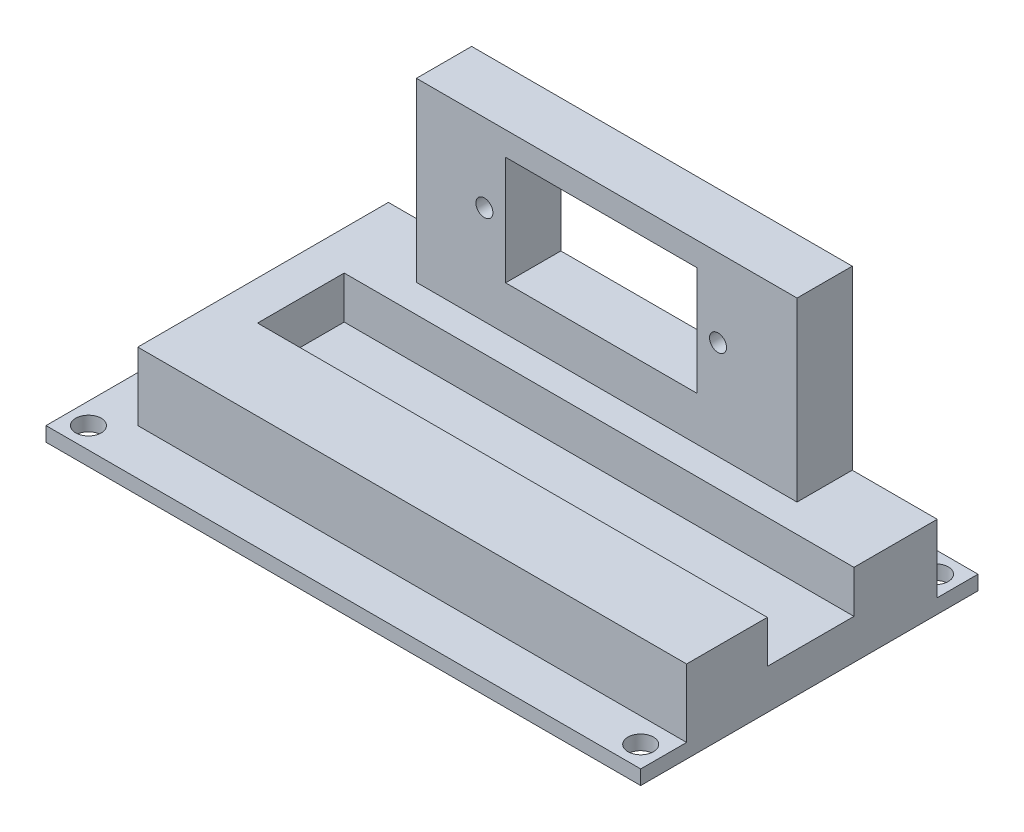
ISO-10303-21;
HEADER;
FILE_DESCRIPTION(('STEP AP214'),'2;1');
FILE_NAME('part.step','',(''),(''),'','','');
FILE_SCHEMA(('AUTOMOTIVE_DESIGN { 1 0 10303 214 1 1 1 1 }'));
ENDSEC;
DATA;
#1=APPLICATION_CONTEXT('core data for automotive mechanical design processes');
#2=APPLICATION_PROTOCOL_DEFINITION('international standard','automotive_design',2000,#1);
#3=PRODUCT_CONTEXT('',#1,'mechanical');
#4=PRODUCT('Part','Part','',(#3));
#5=PRODUCT_RELATED_PRODUCT_CATEGORY('part','',(#4));
#6=PRODUCT_DEFINITION_FORMATION('','',#4);
#7=PRODUCT_DEFINITION_CONTEXT('part definition',#1,'design');
#8=PRODUCT_DEFINITION('design','',#6,#7);
#9=PRODUCT_DEFINITION_SHAPE('','',#8);
#10=(LENGTH_UNIT() NAMED_UNIT(*) SI_UNIT(.MILLI.,.METRE.));
#11=(NAMED_UNIT(*) PLANE_ANGLE_UNIT() SI_UNIT($,.RADIAN.));
#12=(NAMED_UNIT(*) SI_UNIT($,.STERADIAN.) SOLID_ANGLE_UNIT());
#13=UNCERTAINTY_MEASURE_WITH_UNIT(LENGTH_MEASURE(1.E-05),#10,'distance_accuracy_value','');
#14=(GEOMETRIC_REPRESENTATION_CONTEXT(3) GLOBAL_UNCERTAINTY_ASSIGNED_CONTEXT((#13)) GLOBAL_UNIT_ASSIGNED_CONTEXT((#10,
#11,#12)) REPRESENTATION_CONTEXT('',''));
#15=CARTESIAN_POINT('',(0.,0.,0.));
#16=DIRECTION('',(0.,0.,1.));
#17=DIRECTION('',(1.,0.,0.));
#18=AXIS2_PLACEMENT_3D('',#15,#16,#17);
#19=CARTESIAN_POINT('',(-35.,1.7,-19.85));
#20=DIRECTION('',(1.,0.,0.));
#21=DIRECTION('',(0.,0.,-1.));
#22=AXIS2_PLACEMENT_3D('',#19,#20,#21);
#23=PLANE('',#22);
#24=DIRECTION('',(0.,0.,1.));
#25=VECTOR('',#24,1.);
#26=CARTESIAN_POINT('',(-35.,0.,-19.85));
#27=LINE('',#26,#25);
#28=CARTESIAN_POINT('',(-35.,0.,-19.85));
#29=VERTEX_POINT('',#28);
#30=CARTESIAN_POINT('',(-35.,0.,19.85));
#31=VERTEX_POINT('',#30);
#32=EDGE_CURVE('E532',#29,#31,#27,.T.);
#33=ORIENTED_EDGE('',*,*,#32,.T.);
#34=DIRECTION('',(0.,-1.,0.));
#35=VECTOR('',#34,1.);
#36=CARTESIAN_POINT('',(-35.,1.7,19.85));
#37=LINE('',#36,#35);
#38=CARTESIAN_POINT('',(-35.,1.7,19.85));
#39=VERTEX_POINT('',#38);
#40=EDGE_CURVE('E11',#39,#31,#37,.T.);
#41=ORIENTED_EDGE('',*,*,#40,.F.);
#42=DIRECTION('',(0.,0.,1.));
#43=VECTOR('',#42,1.);
#44=CARTESIAN_POINT('',(-35.,1.7,-19.85));
#45=LINE('',#44,#43);
#46=CARTESIAN_POINT('',(-35.,1.7,-19.85));
#47=VERTEX_POINT('',#46);
#48=EDGE_CURVE('E533',#47,#39,#45,.T.);
#49=ORIENTED_EDGE('',*,*,#48,.F.);
#50=DIRECTION('',(0.,-1.,0.));
#51=VECTOR('',#50,1.);
#52=CARTESIAN_POINT('',(-35.,1.7,-19.85));
#53=LINE('',#52,#51);
#54=EDGE_CURVE('E548',#47,#29,#53,.T.);
#55=ORIENTED_EDGE('',*,*,#54,.T.);
#56=EDGE_LOOP('',(#33,#41,#49,#55));
#57=FACE_BOUND('',#56,.T.);
#58=ADVANCED_FACE('F41',(#57),#23,.F.);
#59=CARTESIAN_POINT('',(-35.,1.7,19.85));
#60=DIRECTION('',(0.,0.,-1.));
#61=DIRECTION('',(-1.,0.,0.));
#62=AXIS2_PLACEMENT_3D('',#59,#60,#61);
#63=PLANE('',#62);
#64=DIRECTION('',(1.,0.,0.));
#65=VECTOR('',#64,1.);
#66=CARTESIAN_POINT('',(-35.,0.,19.85));
#67=LINE('',#66,#65);
#68=CARTESIAN_POINT('',(35.,0.,19.85));
#69=VERTEX_POINT('',#68);
#70=EDGE_CURVE('E552',#31,#69,#67,.T.);
#71=ORIENTED_EDGE('',*,*,#70,.T.);
#72=DIRECTION('',(0.,-1.,0.));
#73=VECTOR('',#72,1.);
#74=CARTESIAN_POINT('',(35.,1.7,19.85));
#75=LINE('',#74,#73);
#76=CARTESIAN_POINT('',(35.,1.7,19.85));
#77=VERTEX_POINT('',#76);
#78=EDGE_CURVE('E49',#77,#69,#75,.T.);
#79=ORIENTED_EDGE('',*,*,#78,.F.);
#80=DIRECTION('',(1.,0.,0.));
#81=VECTOR('',#80,1.);
#82=CARTESIAN_POINT('',(-35.,1.7,19.85));
#83=LINE('',#82,#81);
#84=EDGE_CURVE('E537',#39,#77,#83,.T.);
#85=ORIENTED_EDGE('',*,*,#84,.F.);
#86=ORIENTED_EDGE('',*,*,#40,.T.);
#87=EDGE_LOOP('',(#71,#79,#85,#86));
#88=FACE_BOUND('',#87,.T.);
#89=ADVANCED_FACE('F652',(#88),#63,.F.);
#90=CARTESIAN_POINT('',(35.,1.7,-19.85));
#91=DIRECTION('',(-1.,0.,0.));
#92=DIRECTION('',(0.,0.,1.));
#93=AXIS2_PLACEMENT_3D('',#90,#91,#92);
#94=PLANE('',#93);
#95=DIRECTION('',(0.,0.,-1.));
#96=VECTOR('',#95,1.);
#97=CARTESIAN_POINT('',(35.,0.,-19.85));
#98=LINE('',#97,#96);
#99=CARTESIAN_POINT('',(35.,0.,-19.85));
#100=VERTEX_POINT('',#99);
#101=EDGE_CURVE('E555',#69,#100,#98,.T.);
#102=ORIENTED_EDGE('',*,*,#101,.T.);
#103=DIRECTION('',(0.,-1.,0.));
#104=VECTOR('',#103,1.);
#105=CARTESIAN_POINT('',(35.,1.7,-19.85));
#106=LINE('',#105,#104);
#107=CARTESIAN_POINT('',(35.,1.7,-19.85));
#108=VERTEX_POINT('',#107);
#109=EDGE_CURVE('E563',#108,#100,#106,.T.);
#110=ORIENTED_EDGE('',*,*,#109,.F.);
#111=DIRECTION('',(0.,0.,-1.));
#112=VECTOR('',#111,1.);
#113=CARTESIAN_POINT('',(35.,1.7,-19.85));
#114=LINE('',#113,#112);
#115=CARTESIAN_POINT('',(35.,1.7,-15.05));
#116=VERTEX_POINT('',#115);
#117=EDGE_CURVE('E541',#116,#108,#114,.T.);
#118=ORIENTED_EDGE('',*,*,#117,.F.);
#119=DIRECTION('',(0.,-1.,0.));
#120=VECTOR('',#119,1.);
#121=CARTESIAN_POINT('',(35.,9.7,-15.05));
#122=LINE('',#121,#120);
#123=CARTESIAN_POINT('',(35.,9.7,-15.05));
#124=VERTEX_POINT('',#123);
#125=EDGE_CURVE('E528',#124,#116,#122,.T.);
#126=ORIENTED_EDGE('',*,*,#125,.F.);
#127=DIRECTION('',(0.,0.,-1.));
#128=VECTOR('',#127,1.);
#129=CARTESIAN_POINT('',(35.,9.7,-15.05));
#130=LINE('',#129,#128);
#131=CARTESIAN_POINT('',(35.,9.7,-5.25));
#132=VERTEX_POINT('',#131);
#133=EDGE_CURVE('E463',#132,#124,#130,.T.);
#134=ORIENTED_EDGE('',*,*,#133,.F.);
#135=DIRECTION('',(0.,-1.,0.));
#136=VECTOR('',#135,1.);
#137=CARTESIAN_POINT('',(35.,9.7,-5.25));
#138=LINE('',#137,#136);
#139=CARTESIAN_POINT('',(35.,4.7,-5.25));
#140=VERTEX_POINT('',#139);
#141=EDGE_CURVE('E490',#132,#140,#138,.T.);
#142=ORIENTED_EDGE('',*,*,#141,.T.);
#143=DIRECTION('',(0.,0.,-1.));
#144=VECTOR('',#143,1.);
#145=CARTESIAN_POINT('',(35.,4.7,-5.25));
#146=LINE('',#145,#144);
#147=CARTESIAN_POINT('',(35.,4.7,4.95000000000001));
#148=VERTEX_POINT('',#147);
#149=EDGE_CURVE('E456',#148,#140,#146,.T.);
#150=ORIENTED_EDGE('',*,*,#149,.F.);
#151=DIRECTION('',(0.,-1.,0.));
#152=VECTOR('',#151,1.);
#153=CARTESIAN_POINT('',(35.,9.7,4.95));
#154=LINE('',#153,#152);
#155=CARTESIAN_POINT('',(35.,9.7,4.95));
#156=VERTEX_POINT('',#155);
#157=EDGE_CURVE('E512',#156,#148,#154,.T.);
#158=ORIENTED_EDGE('',*,*,#157,.F.);
#159=DIRECTION('',(0.,0.,-1.));
#160=VECTOR('',#159,1.);
#161=CARTESIAN_POINT('',(35.,9.7,14.45));
#162=LINE('',#161,#160);
#163=CARTESIAN_POINT('',(35.,9.7,14.45));
#164=VERTEX_POINT('',#163);
#165=EDGE_CURVE('E478',#164,#156,#162,.T.);
#166=ORIENTED_EDGE('',*,*,#165,.F.);
#167=DIRECTION('',(0.,-1.,0.));
#168=VECTOR('',#167,1.);
#169=CARTESIAN_POINT('',(35.,9.7,14.45));
#170=LINE('',#169,#168);
#171=CARTESIAN_POINT('',(35.,1.7,14.45));
#172=VERTEX_POINT('',#171);
#173=EDGE_CURVE('E516',#164,#172,#170,.T.);
#174=ORIENTED_EDGE('',*,*,#173,.T.);
#175=EDGE_CURVE('E542',#77,#172,#114,.T.);
#176=ORIENTED_EDGE('',*,*,#175,.F.);
#177=ORIENTED_EDGE('',*,*,#78,.T.);
#178=EDGE_LOOP('',(#102,#110,#118,#126,#134,#142,#150,#158,#166,#174,#176,#177));
#179=FACE_BOUND('',#178,.T.);
#180=ADVANCED_FACE('F572',(#179),#94,.F.);
#181=CARTESIAN_POINT('',(-35.,1.7,-19.85));
#182=DIRECTION('',(0.,0.,1.));
#183=DIRECTION('',(1.,0.,0.));
#184=AXIS2_PLACEMENT_3D('',#181,#182,#183);
#185=PLANE('',#184);
#186=DIRECTION('',(-1.,0.,0.));
#187=VECTOR('',#186,1.);
#188=CARTESIAN_POINT('',(-35.,0.,-19.85));
#189=LINE('',#188,#187);
#190=EDGE_CURVE('E538',#100,#29,#189,.T.);
#191=ORIENTED_EDGE('',*,*,#190,.T.);
#192=ORIENTED_EDGE('',*,*,#54,.F.);
#193=DIRECTION('',(-1.,0.,0.));
#194=VECTOR('',#193,1.);
#195=CARTESIAN_POINT('',(-35.,1.7,-19.85));
#196=LINE('',#195,#194);
#197=EDGE_CURVE('E545',#108,#47,#196,.T.);
#198=ORIENTED_EDGE('',*,*,#197,.F.);
#199=ORIENTED_EDGE('',*,*,#109,.T.);
#200=EDGE_LOOP('',(#191,#192,#198,#199));
#201=FACE_BOUND('',#200,.T.);
#202=ADVANCED_FACE('F581',(#201),#185,.F.);
#203=CARTESIAN_POINT('',(0.,1.7,0.));
#204=DIRECTION('',(0.,1.,0.));
#205=DIRECTION('',(0.,0.,1.));
#206=AXIS2_PLACEMENT_3D('',#203,#204,#205);
#207=PLANE('',#206);
#208=CARTESIAN_POINT('',(-32.5,1.7,-17.35));
#209=DIRECTION('',(0.,1.,0.));
#210=DIRECTION('',(0.,0.,1.));
#211=AXIS2_PLACEMENT_3D('',#208,#209,#210);
#212=CIRCLE('',#211,1.5);
#213=CARTESIAN_POINT('',(-32.5,1.7,-15.85));
#214=VERTEX_POINT('',#213);
#215=EDGE_CURVE('E323',#214,#214,#212,.T.);
#216=ORIENTED_EDGE('',*,*,#215,.F.);
#217=EDGE_LOOP('',(#216));
#218=FACE_BOUND('',#217,.T.);
#219=CARTESIAN_POINT('',(32.5,1.7,-17.35));
#220=DIRECTION('',(0.,1.,0.));
#221=DIRECTION('',(0.,0.,1.));
#222=AXIS2_PLACEMENT_3D('',#219,#220,#221);
#223=CIRCLE('',#222,1.5);
#224=CARTESIAN_POINT('',(32.5,1.7,-15.85));
#225=VERTEX_POINT('',#224);
#226=EDGE_CURVE('E324',#225,#225,#223,.T.);
#227=ORIENTED_EDGE('',*,*,#226,.F.);
#228=EDGE_LOOP('',(#227));
#229=FACE_BOUND('',#228,.T.);
#230=CARTESIAN_POINT('',(-32.5,1.7,17.35));
#231=DIRECTION('',(0.,1.,0.));
#232=DIRECTION('',(0.,0.,1.));
#233=AXIS2_PLACEMENT_3D('',#230,#231,#232);
#234=CIRCLE('',#233,1.5);
#235=CARTESIAN_POINT('',(-32.5,1.7,18.85));
#236=VERTEX_POINT('',#235);
#237=EDGE_CURVE('E340',#236,#236,#234,.F.);
#238=ORIENTED_EDGE('',*,*,#237,.T.);
#239=EDGE_LOOP('',(#238));
#240=FACE_BOUND('',#239,.T.);
#241=CARTESIAN_POINT('',(32.5,1.7,17.35));
#242=DIRECTION('',(0.,1.,0.));
#243=DIRECTION('',(0.,0.,1.));
#244=AXIS2_PLACEMENT_3D('',#241,#242,#243);
#245=CIRCLE('',#244,1.5);
#246=CARTESIAN_POINT('',(32.5,1.7,18.85));
#247=VERTEX_POINT('',#246);
#248=EDGE_CURVE('E328',#247,#247,#245,.F.);
#249=ORIENTED_EDGE('',*,*,#248,.T.);
#250=EDGE_LOOP('',(#249));
#251=FACE_BOUND('',#250,.T.);
#252=DIRECTION('',(1.,0.,0.));
#253=VECTOR('',#252,1.);
#254=CARTESIAN_POINT('',(-29.6,1.7,14.45));
#255=LINE('',#254,#253);
#256=CARTESIAN_POINT('',(-29.6,1.7,14.45));
#257=VERTEX_POINT('',#256);
#258=EDGE_CURVE('E468',#257,#172,#255,.T.);
#259=ORIENTED_EDGE('',*,*,#258,.F.);
#260=DIRECTION('',(0.,0.,1.));
#261=VECTOR('',#260,1.);
#262=CARTESIAN_POINT('',(-29.6,1.7,-15.05));
#263=LINE('',#262,#261);
#264=CARTESIAN_POINT('',(-29.6,1.7,-15.05));
#265=VERTEX_POINT('',#264);
#266=EDGE_CURVE('E494',#265,#257,#263,.T.);
#267=ORIENTED_EDGE('',*,*,#266,.F.);
#268=DIRECTION('',(-1.,0.,0.));
#269=VECTOR('',#268,1.);
#270=CARTESIAN_POINT('',(35.,1.7,-15.05));
#271=LINE('',#270,#269);
#272=EDGE_CURVE('E462',#116,#265,#271,.T.);
#273=ORIENTED_EDGE('',*,*,#272,.F.);
#274=ORIENTED_EDGE('',*,*,#117,.T.);
#275=ORIENTED_EDGE('',*,*,#197,.T.);
#276=ORIENTED_EDGE('',*,*,#48,.T.);
#277=ORIENTED_EDGE('',*,*,#84,.T.);
#278=ORIENTED_EDGE('',*,*,#175,.T.);
#279=EDGE_LOOP('',(#259,#267,#273,#274,#275,#276,#277,#278));
#280=FACE_BOUND('',#279,.T.);
#281=ADVANCED_FACE('F587',(#218,#229,#240,#251,#280),#207,.T.);
#282=CARTESIAN_POINT('',(0.,0.,0.));
#283=DIRECTION('',(0.,1.,0.));
#284=DIRECTION('',(0.,0.,1.));
#285=AXIS2_PLACEMENT_3D('',#282,#283,#284);
#286=PLANE('',#285);
#287=DIRECTION('',(-1.,0.,0.));
#288=VECTOR('',#287,1.);
#289=CARTESIAN_POINT('',(32.5,0.,12.85));
#290=LINE('',#289,#288);
#291=CARTESIAN_POINT('',(32.5,0.,12.85));
#292=VERTEX_POINT('',#291);
#293=CARTESIAN_POINT('',(-27.5,0.,12.85));
#294=VERTEX_POINT('',#293);
#295=EDGE_CURVE('E262',#292,#294,#290,.T.);
#296=ORIENTED_EDGE('',*,*,#295,.F.);
#297=DIRECTION('',(0.,0.,1.));
#298=VECTOR('',#297,1.);
#299=CARTESIAN_POINT('',(32.5,0.,12.85));
#300=LINE('',#299,#298);
#301=CARTESIAN_POINT('',(32.5,0.,7.35));
#302=VERTEX_POINT('',#301);
#303=EDGE_CURVE('E56',#302,#292,#300,.T.);
#304=ORIENTED_EDGE('',*,*,#303,.F.);
#305=DIRECTION('',(1.,0.,0.));
#306=VECTOR('',#305,1.);
#307=CARTESIAN_POINT('',(32.5,0.,7.35));
#308=LINE('',#307,#306);
#309=CARTESIAN_POINT('',(-27.5,0.,7.35));
#310=VERTEX_POINT('',#309);
#311=EDGE_CURVE('E249',#310,#302,#308,.T.);
#312=ORIENTED_EDGE('',*,*,#311,.F.);
#313=DIRECTION('',(0.,0.,-1.));
#314=VECTOR('',#313,1.);
#315=CARTESIAN_POINT('',(-27.5,0.,12.85));
#316=LINE('',#315,#314);
#317=EDGE_CURVE('E253',#294,#310,#316,.T.);
#318=ORIENTED_EDGE('',*,*,#317,.F.);
#319=EDGE_LOOP('',(#296,#304,#312,#318));
#320=FACE_BOUND('',#319,.T.);
#321=DIRECTION('',(1.,0.,0.));
#322=VECTOR('',#321,1.);
#323=CARTESIAN_POINT('',(-27.8,0.,-13.35));
#324=LINE('',#323,#322);
#325=CARTESIAN_POINT('',(-27.8,0.,-13.35));
#326=VERTEX_POINT('',#325);
#327=CARTESIAN_POINT('',(32.2,0.,-13.35));
#328=VERTEX_POINT('',#327);
#329=EDGE_CURVE('E296',#326,#328,#324,.T.);
#330=ORIENTED_EDGE('',*,*,#329,.F.);
#331=DIRECTION('',(0.,0.,-1.));
#332=VECTOR('',#331,1.);
#333=CARTESIAN_POINT('',(-27.8,0.,-7.85));
#334=LINE('',#333,#332);
#335=CARTESIAN_POINT('',(-27.8,0.,-7.85));
#336=VERTEX_POINT('',#335);
#337=EDGE_CURVE('E64',#336,#326,#334,.T.);
#338=ORIENTED_EDGE('',*,*,#337,.F.);
#339=DIRECTION('',(-1.,0.,0.));
#340=VECTOR('',#339,1.);
#341=CARTESIAN_POINT('',(-27.8,0.,-7.85));
#342=LINE('',#341,#340);
#343=CARTESIAN_POINT('',(32.2,0.,-7.85));
#344=VERTEX_POINT('',#343);
#345=EDGE_CURVE('E281',#344,#336,#342,.T.);
#346=ORIENTED_EDGE('',*,*,#345,.F.);
#347=DIRECTION('',(0.,0.,1.));
#348=VECTOR('',#347,1.);
#349=CARTESIAN_POINT('',(32.2,0.,-7.85));
#350=LINE('',#349,#348);
#351=EDGE_CURVE('E300',#328,#344,#350,.T.);
#352=ORIENTED_EDGE('',*,*,#351,.F.);
#353=EDGE_LOOP('',(#330,#338,#346,#352));
#354=FACE_BOUND('',#353,.T.);
#355=CARTESIAN_POINT('',(-32.5,0.,-17.35));
#356=DIRECTION('',(0.,1.,0.));
#357=DIRECTION('',(0.,0.,1.));
#358=AXIS2_PLACEMENT_3D('',#355,#356,#357);
#359=CIRCLE('',#358,1.5);
#360=CARTESIAN_POINT('',(-32.5,0.,-15.85));
#361=VERTEX_POINT('',#360);
#362=EDGE_CURVE('E319',#361,#361,#359,.T.);
#363=ORIENTED_EDGE('',*,*,#362,.T.);
#364=EDGE_LOOP('',(#363));
#365=FACE_BOUND('',#364,.T.);
#366=CARTESIAN_POINT('',(32.5,0.,-17.35));
#367=DIRECTION('',(0.,1.,0.));
#368=DIRECTION('',(0.,0.,1.));
#369=AXIS2_PLACEMENT_3D('',#366,#367,#368);
#370=CIRCLE('',#369,1.5);
#371=CARTESIAN_POINT('',(32.5,0.,-15.85));
#372=VERTEX_POINT('',#371);
#373=EDGE_CURVE('E310',#372,#372,#370,.T.);
#374=ORIENTED_EDGE('',*,*,#373,.T.);
#375=EDGE_LOOP('',(#374));
#376=FACE_BOUND('',#375,.T.);
#377=CARTESIAN_POINT('',(-32.5,0.,17.35));
#378=DIRECTION('',(0.,-1.,0.));
#379=DIRECTION('',(0.,0.,-1.));
#380=AXIS2_PLACEMENT_3D('',#377,#378,#379);
#381=CIRCLE('',#380,1.5);
#382=CARTESIAN_POINT('',(-32.5,0.,15.85));
#383=VERTEX_POINT('',#382);
#384=EDGE_CURVE('E335',#383,#383,#381,.T.);
#385=ORIENTED_EDGE('',*,*,#384,.F.);
#386=EDGE_LOOP('',(#385));
#387=FACE_BOUND('',#386,.T.);
#388=CARTESIAN_POINT('',(32.5,0.,17.35));
#389=DIRECTION('',(0.,-1.,0.));
#390=DIRECTION('',(0.,0.,-1.));
#391=AXIS2_PLACEMENT_3D('',#388,#389,#390);
#392=CIRCLE('',#391,1.5);
#393=CARTESIAN_POINT('',(32.5,0.,15.85));
#394=VERTEX_POINT('',#393);
#395=EDGE_CURVE('E344',#394,#394,#392,.T.);
#396=ORIENTED_EDGE('',*,*,#395,.F.);
#397=EDGE_LOOP('',(#396));
#398=FACE_BOUND('',#397,.T.);
#399=ORIENTED_EDGE('',*,*,#32,.F.);
#400=ORIENTED_EDGE('',*,*,#190,.F.);
#401=ORIENTED_EDGE('',*,*,#101,.F.);
#402=ORIENTED_EDGE('',*,*,#70,.F.);
#403=EDGE_LOOP('',(#399,#400,#401,#402));
#404=FACE_BOUND('',#403,.T.);
#405=ADVANCED_FACE('F578',(#320,#354,#365,#376,#387,#398,#404),#286,.F.);
#406=CARTESIAN_POINT('',(35.,9.7,-15.05));
#407=DIRECTION('',(0.,0.,1.));
#408=DIRECTION('',(1.,0.,0.));
#409=AXIS2_PLACEMENT_3D('',#406,#407,#408);
#410=PLANE('',#409);
#411=CARTESIAN_POINT('',(15.7,21.3,-15.05));
#412=DIRECTION('',(0.,0.,-1.));
#413=DIRECTION('',(-1.,0.,0.));
#414=AXIS2_PLACEMENT_3D('',#411,#412,#413);
#415=CIRCLE('',#414,1.00000000000001);
#416=CARTESIAN_POINT('',(14.7,21.3,-15.05));
#417=VERTEX_POINT('',#416);
#418=EDGE_CURVE('E351',#417,#417,#415,.T.);
#419=ORIENTED_EDGE('',*,*,#418,.F.);
#420=EDGE_LOOP('',(#419));
#421=FACE_BOUND('',#420,.T.);
#422=CARTESIAN_POINT('',(-11.8,21.3,-15.05));
#423=DIRECTION('',(0.,0.,-1.));
#424=DIRECTION('',(-1.,0.,0.));
#425=AXIS2_PLACEMENT_3D('',#422,#423,#424);
#426=CIRCLE('',#425,1.);
#427=CARTESIAN_POINT('',(-12.8,21.3,-15.05));
#428=VERTEX_POINT('',#427);
#429=EDGE_CURVE('E339',#428,#428,#426,.T.);
#430=ORIENTED_EDGE('',*,*,#429,.F.);
#431=EDGE_LOOP('',(#430));
#432=FACE_BOUND('',#431,.T.);
#433=DIRECTION('',(-1.,0.,0.));
#434=VECTOR('',#433,1.);
#435=CARTESIAN_POINT('',(13.2,14.9,-15.05));
#436=LINE('',#435,#434);
#437=CARTESIAN_POINT('',(13.2,14.9,-15.05));
#438=VERTEX_POINT('',#437);
#439=CARTESIAN_POINT('',(-9.3,14.9,-15.05));
#440=VERTEX_POINT('',#439);
#441=EDGE_CURVE('E380',#438,#440,#436,.T.);
#442=ORIENTED_EDGE('',*,*,#441,.F.);
#443=DIRECTION('',(0.,-1.,0.));
#444=VECTOR('',#443,1.);
#445=CARTESIAN_POINT('',(13.2,27.7,-15.05));
#446=LINE('',#445,#444);
#447=CARTESIAN_POINT('',(13.2,27.7,-15.05));
#448=VERTEX_POINT('',#447);
#449=EDGE_CURVE('E377',#448,#438,#446,.T.);
#450=ORIENTED_EDGE('',*,*,#449,.F.);
#451=DIRECTION('',(1.,0.,0.));
#452=VECTOR('',#451,1.);
#453=CARTESIAN_POINT('',(13.2,27.7,-15.05));
#454=LINE('',#453,#452);
#455=CARTESIAN_POINT('',(-9.3,27.7,-15.05));
#456=VERTEX_POINT('',#455);
#457=EDGE_CURVE('E388',#456,#448,#454,.T.);
#458=ORIENTED_EDGE('',*,*,#457,.F.);
#459=DIRECTION('',(0.,1.,0.));
#460=VECTOR('',#459,1.);
#461=CARTESIAN_POINT('',(-9.3,27.7,-15.05));
#462=LINE('',#461,#460);
#463=EDGE_CURVE('E384',#440,#456,#462,.T.);
#464=ORIENTED_EDGE('',*,*,#463,.F.);
#465=EDGE_LOOP('',(#442,#450,#458,#464));
#466=FACE_BOUND('',#465,.T.);
#467=ORIENTED_EDGE('',*,*,#272,.T.);
#468=DIRECTION('',(0.,-1.,0.));
#469=VECTOR('',#468,1.);
#470=CARTESIAN_POINT('',(-29.6,9.7,-15.05));
#471=LINE('',#470,#469);
#472=CARTESIAN_POINT('',(-29.6,9.7,-15.05));
#473=VERTEX_POINT('',#472);
#474=EDGE_CURVE('E524',#473,#265,#471,.T.);
#475=ORIENTED_EDGE('',*,*,#474,.F.);
#476=DIRECTION('',(-1.,0.,0.));
#477=VECTOR('',#476,1.);
#478=CARTESIAN_POINT('',(35.,9.7,-15.05));
#479=LINE('',#478,#477);
#480=CARTESIAN_POINT('',(-19.8,9.7,-15.05));
#481=VERTEX_POINT('',#480);
#482=EDGE_CURVE('E467',#481,#473,#479,.T.);
#483=ORIENTED_EDGE('',*,*,#482,.F.);
#484=DIRECTION('',(0.,-1.,0.));
#485=VECTOR('',#484,1.);
#486=CARTESIAN_POINT('',(-19.8,30.5,-15.05));
#487=LINE('',#486,#485);
#488=CARTESIAN_POINT('',(-19.8,30.5,-15.05));
#489=VERTEX_POINT('',#488);
#490=EDGE_CURVE('E424',#489,#481,#487,.T.);
#491=ORIENTED_EDGE('',*,*,#490,.F.);
#492=DIRECTION('',(-1.,0.,0.));
#493=VECTOR('',#492,1.);
#494=CARTESIAN_POINT('',(-19.8,30.5,-15.05));
#495=LINE('',#494,#493);
#496=CARTESIAN_POINT('',(25.,30.5,-15.05));
#497=VERTEX_POINT('',#496);
#498=EDGE_CURVE('E421',#497,#489,#495,.T.);
#499=ORIENTED_EDGE('',*,*,#498,.F.);
#500=DIRECTION('',(0.,-1.,0.));
#501=VECTOR('',#500,1.);
#502=CARTESIAN_POINT('',(25.,30.5,-15.05));
#503=LINE('',#502,#501);
#504=CARTESIAN_POINT('',(25.,9.7,-15.05));
#505=VERTEX_POINT('',#504);
#506=EDGE_CURVE('E438',#497,#505,#503,.T.);
#507=ORIENTED_EDGE('',*,*,#506,.T.);
#508=EDGE_CURVE('E469',#124,#505,#479,.T.);
#509=ORIENTED_EDGE('',*,*,#508,.F.);
#510=ORIENTED_EDGE('',*,*,#125,.T.);
#511=EDGE_LOOP('',(#467,#475,#483,#491,#499,#507,#509,#510));
#512=FACE_BOUND('',#511,.T.);
#513=ADVANCED_FACE('F600',(#421,#432,#466,#512),#410,.F.);
#514=CARTESIAN_POINT('',(-29.6,9.7,-15.05));
#515=DIRECTION('',(1.,0.,0.));
#516=DIRECTION('',(0.,0.,-1.));
#517=AXIS2_PLACEMENT_3D('',#514,#515,#516);
#518=PLANE('',#517);
#519=ORIENTED_EDGE('',*,*,#266,.T.);
#520=DIRECTION('',(0.,-1.,0.));
#521=VECTOR('',#520,1.);
#522=CARTESIAN_POINT('',(-29.6,9.7,14.45));
#523=LINE('',#522,#521);
#524=CARTESIAN_POINT('',(-29.6,9.7,14.45));
#525=VERTEX_POINT('',#524);
#526=EDGE_CURVE('E520',#525,#257,#523,.T.);
#527=ORIENTED_EDGE('',*,*,#526,.F.);
#528=DIRECTION('',(0.,0.,1.));
#529=VECTOR('',#528,1.);
#530=CARTESIAN_POINT('',(-29.6,9.7,-15.05));
#531=LINE('',#530,#529);
#532=EDGE_CURVE('E472',#473,#525,#531,.T.);
#533=ORIENTED_EDGE('',*,*,#532,.F.);
#534=ORIENTED_EDGE('',*,*,#474,.T.);
#535=EDGE_LOOP('',(#519,#527,#533,#534));
#536=FACE_BOUND('',#535,.T.);
#537=ADVANCED_FACE('F602',(#536),#518,.F.);
#538=CARTESIAN_POINT('',(-29.6,9.7,14.45));
#539=DIRECTION('',(0.,0.,-1.));
#540=DIRECTION('',(-1.,0.,0.));
#541=AXIS2_PLACEMENT_3D('',#538,#539,#540);
#542=PLANE('',#541);
#543=ORIENTED_EDGE('',*,*,#258,.T.);
#544=ORIENTED_EDGE('',*,*,#173,.F.);
#545=DIRECTION('',(1.,0.,0.));
#546=VECTOR('',#545,1.);
#547=CARTESIAN_POINT('',(-29.6,9.7,14.45));
#548=LINE('',#547,#546);
#549=EDGE_CURVE('E475',#525,#164,#548,.T.);
#550=ORIENTED_EDGE('',*,*,#549,.F.);
#551=ORIENTED_EDGE('',*,*,#526,.T.);
#552=EDGE_LOOP('',(#543,#544,#550,#551));
#553=FACE_BOUND('',#552,.T.);
#554=ADVANCED_FACE('F606',(#553),#542,.F.);
#555=CARTESIAN_POINT('',(35.,9.7,4.95));
#556=DIRECTION('',(0.,0.,1.));
#557=DIRECTION('',(1.,0.,0.));
#558=AXIS2_PLACEMENT_3D('',#555,#556,#557);
#559=PLANE('',#558);
#560=ORIENTED_EDGE('',*,*,#157,.T.);
#561=DIRECTION('',(1.,0.,0.));
#562=VECTOR('',#561,1.);
#563=CARTESIAN_POINT('',(-25.,4.7,4.95000000000001));
#564=LINE('',#563,#562);
#565=CARTESIAN_POINT('',(-25.,4.7,4.95000000000001));
#566=VERTEX_POINT('',#565);
#567=EDGE_CURVE('E453',#566,#148,#564,.T.);
#568=ORIENTED_EDGE('',*,*,#567,.F.);
#569=DIRECTION('',(0.,-1.,0.));
#570=VECTOR('',#569,1.);
#571=CARTESIAN_POINT('',(-25.,9.7,4.95000000000001));
#572=LINE('',#571,#570);
#573=CARTESIAN_POINT('',(-25.,9.7,4.95000000000001));
#574=VERTEX_POINT('',#573);
#575=EDGE_CURVE('E508',#574,#566,#572,.T.);
#576=ORIENTED_EDGE('',*,*,#575,.F.);
#577=DIRECTION('',(-1.,0.,0.));
#578=VECTOR('',#577,1.);
#579=CARTESIAN_POINT('',(35.,9.7,4.95));
#580=LINE('',#579,#578);
#581=EDGE_CURVE('E481',#156,#574,#580,.T.);
#582=ORIENTED_EDGE('',*,*,#581,.F.);
#583=EDGE_LOOP('',(#560,#568,#576,#582));
#584=FACE_BOUND('',#583,.T.);
#585=ADVANCED_FACE('F614',(#584),#559,.F.);
#586=CARTESIAN_POINT('',(-25.,9.7,4.95000000000001));
#587=DIRECTION('',(-1.,0.,0.));
#588=DIRECTION('',(0.,0.,1.));
#589=AXIS2_PLACEMENT_3D('',#586,#587,#588);
#590=PLANE('',#589);
#591=ORIENTED_EDGE('',*,*,#575,.T.);
#592=DIRECTION('',(0.,0.,1.));
#593=VECTOR('',#592,1.);
#594=CARTESIAN_POINT('',(-25.,4.7,-5.25));
#595=LINE('',#594,#593);
#596=CARTESIAN_POINT('',(-25.,4.7,-5.25));
#597=VERTEX_POINT('',#596);
#598=EDGE_CURVE('E450',#597,#566,#595,.T.);
#599=ORIENTED_EDGE('',*,*,#598,.F.);
#600=DIRECTION('',(0.,-1.,0.));
#601=VECTOR('',#600,1.);
#602=CARTESIAN_POINT('',(-25.,9.7,-5.25));
#603=LINE('',#602,#601);
#604=CARTESIAN_POINT('',(-25.,9.7,-5.25));
#605=VERTEX_POINT('',#604);
#606=EDGE_CURVE('E504',#605,#597,#603,.T.);
#607=ORIENTED_EDGE('',*,*,#606,.F.);
#608=DIRECTION('',(0.,0.,-1.));
#609=VECTOR('',#608,1.);
#610=CARTESIAN_POINT('',(-25.,9.7,4.95000000000001));
#611=LINE('',#610,#609);
#612=EDGE_CURVE('E484',#574,#605,#611,.T.);
#613=ORIENTED_EDGE('',*,*,#612,.F.);
#614=EDGE_LOOP('',(#591,#599,#607,#613));
#615=FACE_BOUND('',#614,.T.);
#616=ADVANCED_FACE('F619',(#615),#590,.F.);
#617=CARTESIAN_POINT('',(-25.,9.7,-5.25));
#618=DIRECTION('',(0.,0.,-1.));
#619=DIRECTION('',(-1.,0.,0.));
#620=AXIS2_PLACEMENT_3D('',#617,#618,#619);
#621=PLANE('',#620);
#622=ORIENTED_EDGE('',*,*,#606,.T.);
#623=DIRECTION('',(-1.,0.,0.));
#624=VECTOR('',#623,1.);
#625=CARTESIAN_POINT('',(-25.,4.7,-5.25));
#626=LINE('',#625,#624);
#627=EDGE_CURVE('E459',#140,#597,#626,.T.);
#628=ORIENTED_EDGE('',*,*,#627,.F.);
#629=ORIENTED_EDGE('',*,*,#141,.F.);
#630=DIRECTION('',(1.,0.,0.));
#631=VECTOR('',#630,1.);
#632=CARTESIAN_POINT('',(-25.,9.7,-5.25));
#633=LINE('',#632,#631);
#634=EDGE_CURVE('E487',#605,#132,#633,.T.);
#635=ORIENTED_EDGE('',*,*,#634,.F.);
#636=EDGE_LOOP('',(#622,#628,#629,#635));
#637=FACE_BOUND('',#636,.T.);
#638=ADVANCED_FACE('F625',(#637),#621,.F.);
#639=CARTESIAN_POINT('',(0.,9.7,0.));
#640=DIRECTION('',(0.,1.,0.));
#641=DIRECTION('',(0.,0.,1.));
#642=AXIS2_PLACEMENT_3D('',#639,#640,#641);
#643=PLANE('',#642);
#644=DIRECTION('',(0.,0.,1.));
#645=VECTOR('',#644,1.);
#646=CARTESIAN_POINT('',(-19.8,9.7,-15.05));
#647=LINE('',#646,#645);
#648=CARTESIAN_POINT('',(-19.8,9.7,-8.55000000000001));
#649=VERTEX_POINT('',#648);
#650=EDGE_CURVE('E409',#481,#649,#647,.T.);
#651=ORIENTED_EDGE('',*,*,#650,.F.);
#652=ORIENTED_EDGE('',*,*,#482,.T.);
#653=ORIENTED_EDGE('',*,*,#532,.T.);
#654=ORIENTED_EDGE('',*,*,#549,.T.);
#655=ORIENTED_EDGE('',*,*,#165,.T.);
#656=ORIENTED_EDGE('',*,*,#581,.T.);
#657=ORIENTED_EDGE('',*,*,#612,.T.);
#658=ORIENTED_EDGE('',*,*,#634,.T.);
#659=ORIENTED_EDGE('',*,*,#133,.T.);
#660=ORIENTED_EDGE('',*,*,#508,.T.);
#661=DIRECTION('',(0.,0.,-1.));
#662=VECTOR('',#661,1.);
#663=CARTESIAN_POINT('',(25.,9.7,-15.05));
#664=LINE('',#663,#662);
#665=CARTESIAN_POINT('',(25.,9.7,-8.55000000000001));
#666=VERTEX_POINT('',#665);
#667=EDGE_CURVE('E415',#666,#505,#664,.T.);
#668=ORIENTED_EDGE('',*,*,#667,.F.);
#669=DIRECTION('',(1.,0.,0.));
#670=VECTOR('',#669,1.);
#671=CARTESIAN_POINT('',(-19.8,9.7,-8.55000000000001));
#672=LINE('',#671,#670);
#673=EDGE_CURVE('E428',#649,#666,#672,.T.);
#674=ORIENTED_EDGE('',*,*,#673,.F.);
#675=EDGE_LOOP('',(#651,#652,#653,#654,#655,#656,#657,#658,#659,#660,#668,#674));
#676=FACE_BOUND('',#675,.T.);
#677=ADVANCED_FACE('F595',(#676),#643,.T.);
#678=CARTESIAN_POINT('',(0.,4.7,0.));
#679=DIRECTION('',(0.,1.,0.));
#680=DIRECTION('',(0.,0.,1.));
#681=AXIS2_PLACEMENT_3D('',#678,#679,#680);
#682=PLANE('',#681);
#683=ORIENTED_EDGE('',*,*,#598,.T.);
#684=ORIENTED_EDGE('',*,*,#567,.T.);
#685=ORIENTED_EDGE('',*,*,#149,.T.);
#686=ORIENTED_EDGE('',*,*,#627,.T.);
#687=EDGE_LOOP('',(#683,#684,#685,#686));
#688=FACE_BOUND('',#687,.T.);
#689=ADVANCED_FACE('F684',(#688),#682,.T.);
#690=CARTESIAN_POINT('',(-19.8,30.5,-15.05));
#691=DIRECTION('',(1.,0.,0.));
#692=DIRECTION('',(0.,0.,-1.));
#693=AXIS2_PLACEMENT_3D('',#690,#691,#692);
#694=PLANE('',#693);
#695=ORIENTED_EDGE('',*,*,#650,.T.);
#696=DIRECTION('',(0.,-1.,0.));
#697=VECTOR('',#696,1.);
#698=CARTESIAN_POINT('',(-19.8,30.5,-8.55000000000001));
#699=LINE('',#698,#697);
#700=CARTESIAN_POINT('',(-19.8,30.5,-8.55000000000001));
#701=VERTEX_POINT('',#700);
#702=EDGE_CURVE('E446',#701,#649,#699,.T.);
#703=ORIENTED_EDGE('',*,*,#702,.F.);
#704=DIRECTION('',(0.,0.,1.));
#705=VECTOR('',#704,1.);
#706=CARTESIAN_POINT('',(-19.8,30.5,-15.05));
#707=LINE('',#706,#705);
#708=EDGE_CURVE('E410',#489,#701,#707,.T.);
#709=ORIENTED_EDGE('',*,*,#708,.F.);
#710=ORIENTED_EDGE('',*,*,#490,.T.);
#711=EDGE_LOOP('',(#695,#703,#709,#710));
#712=FACE_BOUND('',#711,.T.);
#713=ADVANCED_FACE('F637',(#712),#694,.F.);
#714=CARTESIAN_POINT('',(-19.8,30.5,-8.55000000000001));
#715=DIRECTION('',(0.,0.,-1.));
#716=DIRECTION('',(-1.,0.,0.));
#717=AXIS2_PLACEMENT_3D('',#714,#715,#716);
#718=PLANE('',#717);
#719=CARTESIAN_POINT('',(15.7,21.3,-8.55000000000001));
#720=DIRECTION('',(0.,0.,-1.));
#721=DIRECTION('',(-1.,0.,0.));
#722=AXIS2_PLACEMENT_3D('',#719,#720,#721);
#723=CIRCLE('',#722,1.00000000000001);
#724=CARTESIAN_POINT('',(14.7,21.3,-8.55000000000001));
#725=VERTEX_POINT('',#724);
#726=EDGE_CURVE('E355',#725,#725,#723,.F.);
#727=ORIENTED_EDGE('',*,*,#726,.F.);
#728=EDGE_LOOP('',(#727));
#729=FACE_BOUND('',#728,.T.);
#730=CARTESIAN_POINT('',(-11.8,21.3,-8.55000000000001));
#731=DIRECTION('',(0.,0.,-1.));
#732=DIRECTION('',(-1.,0.,0.));
#733=AXIS2_PLACEMENT_3D('',#730,#731,#732);
#734=CIRCLE('',#733,1.);
#735=CARTESIAN_POINT('',(-12.8,21.3,-8.55000000000001));
#736=VERTEX_POINT('',#735);
#737=EDGE_CURVE('E356',#736,#736,#734,.F.);
#738=ORIENTED_EDGE('',*,*,#737,.F.);
#739=EDGE_LOOP('',(#738));
#740=FACE_BOUND('',#739,.T.);
#741=DIRECTION('',(-1.,0.,0.));
#742=VECTOR('',#741,1.);
#743=CARTESIAN_POINT('',(13.2,27.7,-8.55000000000001));
#744=LINE('',#743,#742);
#745=CARTESIAN_POINT('',(13.2,27.7,-8.55000000000001));
#746=VERTEX_POINT('',#745);
#747=CARTESIAN_POINT('',(-9.3,27.7,-8.55000000000001));
#748=VERTEX_POINT('',#747);
#749=EDGE_CURVE('E369',#746,#748,#744,.T.);
#750=ORIENTED_EDGE('',*,*,#749,.F.);
#751=DIRECTION('',(0.,1.,0.));
#752=VECTOR('',#751,1.);
#753=CARTESIAN_POINT('',(13.2,27.7,-8.55000000000001));
#754=LINE('',#753,#752);
#755=CARTESIAN_POINT('',(13.2,14.9,-8.55000000000001));
#756=VERTEX_POINT('',#755);
#757=EDGE_CURVE('E373',#756,#746,#754,.T.);
#758=ORIENTED_EDGE('',*,*,#757,.F.);
#759=DIRECTION('',(1.,0.,0.));
#760=VECTOR('',#759,1.);
#761=CARTESIAN_POINT('',(13.2,14.9,-8.55000000000001));
#762=LINE('',#761,#760);
#763=CARTESIAN_POINT('',(-9.3,14.9,-8.55000000000001));
#764=VERTEX_POINT('',#763);
#765=EDGE_CURVE('E396',#764,#756,#762,.T.);
#766=ORIENTED_EDGE('',*,*,#765,.F.);
#767=DIRECTION('',(0.,-1.,0.));
#768=VECTOR('',#767,1.);
#769=CARTESIAN_POINT('',(-9.3,27.7,-8.55000000000001));
#770=LINE('',#769,#768);
#771=EDGE_CURVE('E360',#748,#764,#770,.T.);
#772=ORIENTED_EDGE('',*,*,#771,.F.);
#773=EDGE_LOOP('',(#750,#758,#766,#772));
#774=FACE_BOUND('',#773,.T.);
#775=ORIENTED_EDGE('',*,*,#673,.T.);
#776=DIRECTION('',(0.,-1.,0.));
#777=VECTOR('',#776,1.);
#778=CARTESIAN_POINT('',(25.,30.5,-8.55000000000001));
#779=LINE('',#778,#777);
#780=CARTESIAN_POINT('',(25.,30.5,-8.55000000000001));
#781=VERTEX_POINT('',#780);
#782=EDGE_CURVE('E442',#781,#666,#779,.T.);
#783=ORIENTED_EDGE('',*,*,#782,.F.);
#784=DIRECTION('',(1.,0.,0.));
#785=VECTOR('',#784,1.);
#786=CARTESIAN_POINT('',(-19.8,30.5,-8.55000000000001));
#787=LINE('',#786,#785);
#788=EDGE_CURVE('E414',#701,#781,#787,.T.);
#789=ORIENTED_EDGE('',*,*,#788,.F.);
#790=ORIENTED_EDGE('',*,*,#702,.T.);
#791=EDGE_LOOP('',(#775,#783,#789,#790));
#792=FACE_BOUND('',#791,.T.);
#793=ADVANCED_FACE('F633',(#729,#740,#774,#792),#718,.F.);
#794=CARTESIAN_POINT('',(25.,30.5,-15.05));
#795=DIRECTION('',(-1.,0.,0.));
#796=DIRECTION('',(0.,0.,1.));
#797=AXIS2_PLACEMENT_3D('',#794,#795,#796);
#798=PLANE('',#797);
#799=ORIENTED_EDGE('',*,*,#667,.T.);
#800=ORIENTED_EDGE('',*,*,#506,.F.);
#801=DIRECTION('',(0.,0.,-1.));
#802=VECTOR('',#801,1.);
#803=CARTESIAN_POINT('',(25.,30.5,-15.05));
#804=LINE('',#803,#802);
#805=EDGE_CURVE('E418',#781,#497,#804,.T.);
#806=ORIENTED_EDGE('',*,*,#805,.F.);
#807=ORIENTED_EDGE('',*,*,#782,.T.);
#808=EDGE_LOOP('',(#799,#800,#806,#807));
#809=FACE_BOUND('',#808,.T.);
#810=ADVANCED_FACE('F629',(#809),#798,.F.);
#811=CARTESIAN_POINT('',(0.,30.5,0.));
#812=DIRECTION('',(0.,1.,0.));
#813=DIRECTION('',(0.,0.,1.));
#814=AXIS2_PLACEMENT_3D('',#811,#812,#813);
#815=PLANE('',#814);
#816=ORIENTED_EDGE('',*,*,#708,.T.);
#817=ORIENTED_EDGE('',*,*,#788,.T.);
#818=ORIENTED_EDGE('',*,*,#805,.T.);
#819=ORIENTED_EDGE('',*,*,#498,.T.);
#820=EDGE_LOOP('',(#816,#817,#818,#819));
#821=FACE_BOUND('',#820,.T.);
#822=ADVANCED_FACE('F639',(#821),#815,.T.);
#823=CARTESIAN_POINT('',(13.2,27.7,19.851));
#824=DIRECTION('',(1.,0.,0.));
#825=DIRECTION('',(0.,1.,0.));
#826=AXIS2_PLACEMENT_3D('',#823,#824,#825);
#827=PLANE('',#826);
#828=ORIENTED_EDGE('',*,*,#757,.T.);
#829=DIRECTION('',(0.,0.,-1.));
#830=VECTOR('',#829,1.);
#831=CARTESIAN_POINT('',(13.2,27.7,19.851));
#832=LINE('',#831,#830);
#833=EDGE_CURVE('E393',#746,#448,#832,.T.);
#834=ORIENTED_EDGE('',*,*,#833,.T.);
#835=ORIENTED_EDGE('',*,*,#449,.T.);
#836=DIRECTION('',(0.,0.,-1.));
#837=VECTOR('',#836,1.);
#838=CARTESIAN_POINT('',(13.2,14.9,19.851));
#839=LINE('',#838,#837);
#840=EDGE_CURVE('E392',#756,#438,#839,.T.);
#841=ORIENTED_EDGE('',*,*,#840,.F.);
#842=EDGE_LOOP('',(#828,#834,#835,#841));
#843=FACE_BOUND('',#842,.T.);
#844=ADVANCED_FACE('F641',(#843),#827,.F.);
#845=CARTESIAN_POINT('',(13.2,27.7,19.851));
#846=DIRECTION('',(0.,1.,0.));
#847=DIRECTION('',(0.,0.,1.));
#848=AXIS2_PLACEMENT_3D('',#845,#846,#847);
#849=PLANE('',#848);
#850=ORIENTED_EDGE('',*,*,#749,.T.);
#851=DIRECTION('',(0.,0.,-1.));
#852=VECTOR('',#851,1.);
#853=CARTESIAN_POINT('',(-9.3,27.7,19.851));
#854=LINE('',#853,#852);
#855=EDGE_CURVE('E397',#748,#456,#854,.T.);
#856=ORIENTED_EDGE('',*,*,#855,.T.);
#857=ORIENTED_EDGE('',*,*,#457,.T.);
#858=ORIENTED_EDGE('',*,*,#833,.F.);
#859=EDGE_LOOP('',(#850,#856,#857,#858));
#860=FACE_BOUND('',#859,.T.);
#861=ADVANCED_FACE('F647',(#860),#849,.F.);
#862=CARTESIAN_POINT('',(-9.3,27.7,19.851));
#863=DIRECTION('',(-1.,0.,0.));
#864=DIRECTION('',(0.,-1.,0.));
#865=AXIS2_PLACEMENT_3D('',#862,#863,#864);
#866=PLANE('',#865);
#867=ORIENTED_EDGE('',*,*,#771,.T.);
#868=DIRECTION('',(0.,0.,-1.));
#869=VECTOR('',#868,1.);
#870=CARTESIAN_POINT('',(-9.3,14.9,19.851));
#871=LINE('',#870,#869);
#872=EDGE_CURVE('E400',#764,#440,#871,.T.);
#873=ORIENTED_EDGE('',*,*,#872,.T.);
#874=ORIENTED_EDGE('',*,*,#463,.T.);
#875=ORIENTED_EDGE('',*,*,#855,.F.);
#876=EDGE_LOOP('',(#867,#873,#874,#875));
#877=FACE_BOUND('',#876,.T.);
#878=ADVANCED_FACE('F711',(#877),#866,.F.);
#879=CARTESIAN_POINT('',(13.2,14.9,19.851));
#880=DIRECTION('',(0.,-1.,0.));
#881=DIRECTION('',(0.,0.,-1.));
#882=AXIS2_PLACEMENT_3D('',#879,#880,#881);
#883=PLANE('',#882);
#884=ORIENTED_EDGE('',*,*,#765,.T.);
#885=ORIENTED_EDGE('',*,*,#840,.T.);
#886=ORIENTED_EDGE('',*,*,#441,.T.);
#887=ORIENTED_EDGE('',*,*,#872,.F.);
#888=EDGE_LOOP('',(#884,#885,#886,#887));
#889=FACE_BOUND('',#888,.T.);
#890=ADVANCED_FACE('F708',(#889),#883,.F.);
#891=CARTESIAN_POINT('',(-11.8,21.3,19.851));
#892=DIRECTION('',(0.,0.,-1.));
#893=DIRECTION('',(-1.,0.,0.));
#894=AXIS2_PLACEMENT_3D('',#891,#892,#893);
#895=CYLINDRICAL_SURFACE('',#894,1.);
#896=ORIENTED_EDGE('',*,*,#429,.T.);
#897=EDGE_LOOP('',(#896));
#898=FACE_BOUND('',#897,.T.);
#899=ORIENTED_EDGE('',*,*,#737,.T.);
#900=EDGE_LOOP('',(#899));
#901=FACE_BOUND('',#900,.T.);
#902=ADVANCED_FACE('F719',(#898,#901),#895,.F.);
#903=CARTESIAN_POINT('',(15.7,21.3,19.851));
#904=DIRECTION('',(0.,0.,-1.));
#905=DIRECTION('',(-1.,0.,0.));
#906=AXIS2_PLACEMENT_3D('',#903,#904,#905);
#907=CYLINDRICAL_SURFACE('',#906,1.00000000000001);
#908=ORIENTED_EDGE('',*,*,#418,.T.);
#909=EDGE_LOOP('',(#908));
#910=FACE_BOUND('',#909,.T.);
#911=ORIENTED_EDGE('',*,*,#726,.T.);
#912=EDGE_LOOP('',(#911));
#913=FACE_BOUND('',#912,.T.);
#914=ADVANCED_FACE('F725',(#910,#913),#907,.F.);
#915=CARTESIAN_POINT('',(32.5,30.501,17.35));
#916=DIRECTION('',(0.,-1.,0.));
#917=DIRECTION('',(0.,0.,-1.));
#918=AXIS2_PLACEMENT_3D('',#915,#916,#917);
#919=CYLINDRICAL_SURFACE('',#918,1.5);
#920=ORIENTED_EDGE('',*,*,#248,.F.);
#921=EDGE_LOOP('',(#920));
#922=FACE_BOUND('',#921,.T.);
#923=ORIENTED_EDGE('',*,*,#395,.T.);
#924=EDGE_LOOP('',(#923));
#925=FACE_BOUND('',#924,.T.);
#926=ADVANCED_FACE('F729',(#922,#925),#919,.F.);
#927=CARTESIAN_POINT('',(-32.5,30.501,17.35));
#928=DIRECTION('',(0.,-1.,0.));
#929=DIRECTION('',(0.,0.,-1.));
#930=AXIS2_PLACEMENT_3D('',#927,#928,#929);
#931=CYLINDRICAL_SURFACE('',#930,1.5);
#932=ORIENTED_EDGE('',*,*,#237,.F.);
#933=EDGE_LOOP('',(#932));
#934=FACE_BOUND('',#933,.T.);
#935=ORIENTED_EDGE('',*,*,#384,.T.);
#936=EDGE_LOOP('',(#935));
#937=FACE_BOUND('',#936,.T.);
#938=ADVANCED_FACE('F733',(#934,#937),#931,.F.);
#939=CARTESIAN_POINT('',(32.5,30.501,-17.35));
#940=DIRECTION('',(0.,-1.,0.));
#941=DIRECTION('',(0.,0.,-1.));
#942=AXIS2_PLACEMENT_3D('',#939,#940,#941);
#943=CYLINDRICAL_SURFACE('',#942,1.5);
#944=ORIENTED_EDGE('',*,*,#226,.T.);
#945=EDGE_LOOP('',(#944));
#946=FACE_BOUND('',#945,.T.);
#947=ORIENTED_EDGE('',*,*,#373,.F.);
#948=EDGE_LOOP('',(#947));
#949=FACE_BOUND('',#948,.T.);
#950=ADVANCED_FACE('F737',(#946,#949),#943,.F.);
#951=CARTESIAN_POINT('',(-32.5,30.501,-17.35));
#952=DIRECTION('',(0.,-1.,0.));
#953=DIRECTION('',(0.,0.,-1.));
#954=AXIS2_PLACEMENT_3D('',#951,#952,#953);
#955=CYLINDRICAL_SURFACE('',#954,1.5);
#956=ORIENTED_EDGE('',*,*,#215,.T.);
#957=EDGE_LOOP('',(#956));
#958=FACE_BOUND('',#957,.T.);
#959=ORIENTED_EDGE('',*,*,#362,.F.);
#960=EDGE_LOOP('',(#959));
#961=FACE_BOUND('',#960,.T.);
#962=ADVANCED_FACE('F741',(#958,#961),#955,.F.);
#963=CARTESIAN_POINT('',(-27.8,4.5,-7.85));
#964=DIRECTION('',(-1.,0.,0.));
#965=DIRECTION('',(0.,0.,1.));
#966=AXIS2_PLACEMENT_3D('',#963,#964,#965);
#967=PLANE('',#966);
#968=ORIENTED_EDGE('',*,*,#337,.T.);
#969=DIRECTION('',(0.,-1.,0.));
#970=VECTOR('',#969,1.);
#971=CARTESIAN_POINT('',(-27.8,4.5,-13.35));
#972=LINE('',#971,#970);
#973=CARTESIAN_POINT('',(-27.8,4.5,-13.35));
#974=VERTEX_POINT('',#973);
#975=EDGE_CURVE('E293',#974,#326,#972,.T.);
#976=ORIENTED_EDGE('',*,*,#975,.F.);
#977=DIRECTION('',(0.,0.,-1.));
#978=VECTOR('',#977,1.);
#979=CARTESIAN_POINT('',(-27.8,4.5,-7.85));
#980=LINE('',#979,#978);
#981=CARTESIAN_POINT('',(-27.8,4.5,-7.85));
#982=VERTEX_POINT('',#981);
#983=EDGE_CURVE('E276',#982,#974,#980,.T.);
#984=ORIENTED_EDGE('',*,*,#983,.F.);
#985=DIRECTION('',(0.,-1.,0.));
#986=VECTOR('',#985,1.);
#987=CARTESIAN_POINT('',(-27.8,4.5,-7.85));
#988=LINE('',#987,#986);
#989=EDGE_CURVE('E307',#982,#336,#988,.T.);
#990=ORIENTED_EDGE('',*,*,#989,.T.);
#991=EDGE_LOOP('',(#968,#976,#984,#990));
#992=FACE_BOUND('',#991,.T.);
#993=ADVANCED_FACE('F745',(#992),#967,.F.);
#994=CARTESIAN_POINT('',(-27.8,4.5,-7.85));
#995=DIRECTION('',(0.,0.,1.));
#996=DIRECTION('',(1.,0.,0.));
#997=AXIS2_PLACEMENT_3D('',#994,#995,#996);
#998=PLANE('',#997);
#999=ORIENTED_EDGE('',*,*,#345,.T.);
#1000=ORIENTED_EDGE('',*,*,#989,.F.);
#1001=DIRECTION('',(-1.,0.,0.));
#1002=VECTOR('',#1001,1.);
#1003=CARTESIAN_POINT('',(-27.8,4.5,-7.85));
#1004=LINE('',#1003,#1002);
#1005=CARTESIAN_POINT('',(32.2,4.5,-7.85));
#1006=VERTEX_POINT('',#1005);
#1007=EDGE_CURVE('E289',#1006,#982,#1004,.T.);
#1008=ORIENTED_EDGE('',*,*,#1007,.F.);
#1009=DIRECTION('',(0.,-1.,0.));
#1010=VECTOR('',#1009,1.);
#1011=CARTESIAN_POINT('',(32.2,4.5,-7.85));
#1012=LINE('',#1011,#1010);
#1013=EDGE_CURVE('E311',#1006,#344,#1012,.T.);
#1014=ORIENTED_EDGE('',*,*,#1013,.T.);
#1015=EDGE_LOOP('',(#999,#1000,#1008,#1014));
#1016=FACE_BOUND('',#1015,.T.);
#1017=ADVANCED_FACE('F749',(#1016),#998,.F.);
#1018=CARTESIAN_POINT('',(32.2,4.5,-7.85));
#1019=DIRECTION('',(1.,0.,0.));
#1020=DIRECTION('',(0.,0.,-1.));
#1021=AXIS2_PLACEMENT_3D('',#1018,#1019,#1020);
#1022=PLANE('',#1021);
#1023=ORIENTED_EDGE('',*,*,#351,.T.);
#1024=ORIENTED_EDGE('',*,*,#1013,.F.);
#1025=DIRECTION('',(0.,0.,1.));
#1026=VECTOR('',#1025,1.);
#1027=CARTESIAN_POINT('',(32.2,4.5,-7.85));
#1028=LINE('',#1027,#1026);
#1029=CARTESIAN_POINT('',(32.2,4.5,-13.35));
#1030=VERTEX_POINT('',#1029);
#1031=EDGE_CURVE('E285',#1030,#1006,#1028,.T.);
#1032=ORIENTED_EDGE('',*,*,#1031,.F.);
#1033=DIRECTION('',(0.,-1.,0.));
#1034=VECTOR('',#1033,1.);
#1035=CARTESIAN_POINT('',(32.2,4.5,-13.35));
#1036=LINE('',#1035,#1034);
#1037=EDGE_CURVE('E314',#1030,#328,#1036,.T.);
#1038=ORIENTED_EDGE('',*,*,#1037,.T.);
#1039=EDGE_LOOP('',(#1023,#1024,#1032,#1038));
#1040=FACE_BOUND('',#1039,.T.);
#1041=ADVANCED_FACE('F754',(#1040),#1022,.F.);
#1042=CARTESIAN_POINT('',(-27.8,4.5,-13.35));
#1043=DIRECTION('',(0.,0.,-1.));
#1044=DIRECTION('',(-1.,0.,0.));
#1045=AXIS2_PLACEMENT_3D('',#1042,#1043,#1044);
#1046=PLANE('',#1045);
#1047=ORIENTED_EDGE('',*,*,#329,.T.);
#1048=ORIENTED_EDGE('',*,*,#1037,.F.);
#1049=DIRECTION('',(1.,0.,0.));
#1050=VECTOR('',#1049,1.);
#1051=CARTESIAN_POINT('',(-27.8,4.5,-13.35));
#1052=LINE('',#1051,#1050);
#1053=EDGE_CURVE('E280',#974,#1030,#1052,.T.);
#1054=ORIENTED_EDGE('',*,*,#1053,.F.);
#1055=ORIENTED_EDGE('',*,*,#975,.T.);
#1056=EDGE_LOOP('',(#1047,#1048,#1054,#1055));
#1057=FACE_BOUND('',#1056,.T.);
#1058=ADVANCED_FACE('F750',(#1057),#1046,.F.);
#1059=CARTESIAN_POINT('',(0.,4.5,0.));
#1060=DIRECTION('',(0.,-1.,0.));
#1061=DIRECTION('',(0.,0.,-1.));
#1062=AXIS2_PLACEMENT_3D('',#1059,#1060,#1061);
#1063=PLANE('',#1062);
#1064=ORIENTED_EDGE('',*,*,#983,.T.);
#1065=ORIENTED_EDGE('',*,*,#1053,.T.);
#1066=ORIENTED_EDGE('',*,*,#1031,.T.);
#1067=ORIENTED_EDGE('',*,*,#1007,.T.);
#1068=EDGE_LOOP('',(#1064,#1065,#1066,#1067));
#1069=FACE_BOUND('',#1068,.T.);
#1070=ADVANCED_FACE('F753',(#1069),#1063,.T.);
#1071=CARTESIAN_POINT('',(32.5,4.5,12.85));
#1072=DIRECTION('',(1.,0.,0.));
#1073=DIRECTION('',(0.,0.,-1.));
#1074=AXIS2_PLACEMENT_3D('',#1071,#1072,#1073);
#1075=PLANE('',#1074);
#1076=ORIENTED_EDGE('',*,*,#303,.T.);
#1077=DIRECTION('',(0.,-1.,0.));
#1078=VECTOR('',#1077,1.);
#1079=CARTESIAN_POINT('',(32.5,4.5,12.85));
#1080=LINE('',#1079,#1078);
#1081=CARTESIAN_POINT('',(32.5,4.5,12.85));
#1082=VERTEX_POINT('',#1081);
#1083=EDGE_CURVE('E224',#1082,#292,#1080,.T.);
#1084=ORIENTED_EDGE('',*,*,#1083,.F.);
#1085=DIRECTION('',(0.,0.,1.));
#1086=VECTOR('',#1085,1.);
#1087=CARTESIAN_POINT('',(32.5,4.5,12.85));
#1088=LINE('',#1087,#1086);
#1089=CARTESIAN_POINT('',(32.5,4.5,7.35));
#1090=VERTEX_POINT('',#1089);
#1091=EDGE_CURVE('E228',#1090,#1082,#1088,.T.);
#1092=ORIENTED_EDGE('',*,*,#1091,.F.);
#1093=DIRECTION('',(0.,-1.,0.));
#1094=VECTOR('',#1093,1.);
#1095=CARTESIAN_POINT('',(32.5,4.5,7.35));
#1096=LINE('',#1095,#1094);
#1097=EDGE_CURVE('E268',#1090,#302,#1096,.T.);
#1098=ORIENTED_EDGE('',*,*,#1097,.T.);
#1099=EDGE_LOOP('',(#1076,#1084,#1092,#1098));
#1100=FACE_BOUND('',#1099,.T.);
#1101=ADVANCED_FACE('F226',(#1100),#1075,.F.);
#1102=CARTESIAN_POINT('',(32.5,4.5,7.35));
#1103=DIRECTION('',(0.,0.,-1.));
#1104=DIRECTION('',(-1.,0.,0.));
#1105=AXIS2_PLACEMENT_3D('',#1102,#1103,#1104);
#1106=PLANE('',#1105);
#1107=ORIENTED_EDGE('',*,*,#311,.T.);
#1108=ORIENTED_EDGE('',*,*,#1097,.F.);
#1109=DIRECTION('',(1.,0.,0.));
#1110=VECTOR('',#1109,1.);
#1111=CARTESIAN_POINT('',(32.5,4.5,7.35));
#1112=LINE('',#1111,#1110);
#1113=CARTESIAN_POINT('',(-27.5,4.5,7.35));
#1114=VERTEX_POINT('',#1113);
#1115=EDGE_CURVE('E235',#1114,#1090,#1112,.T.);
#1116=ORIENTED_EDGE('',*,*,#1115,.F.);
#1117=DIRECTION('',(0.,-1.,0.));
#1118=VECTOR('',#1117,1.);
#1119=CARTESIAN_POINT('',(-27.5,4.5,7.35));
#1120=LINE('',#1119,#1118);
#1121=EDGE_CURVE('E271',#1114,#310,#1120,.T.);
#1122=ORIENTED_EDGE('',*,*,#1121,.T.);
#1123=EDGE_LOOP('',(#1107,#1108,#1116,#1122));
#1124=FACE_BOUND('',#1123,.T.);
#1125=ADVANCED_FACE('F767',(#1124),#1106,.F.);
#1126=CARTESIAN_POINT('',(-27.5,4.5,12.85));
#1127=DIRECTION('',(-1.,0.,0.));
#1128=DIRECTION('',(0.,0.,1.));
#1129=AXIS2_PLACEMENT_3D('',#1126,#1127,#1128);
#1130=PLANE('',#1129);
#1131=ORIENTED_EDGE('',*,*,#317,.T.);
#1132=ORIENTED_EDGE('',*,*,#1121,.F.);
#1133=DIRECTION('',(0.,0.,-1.));
#1134=VECTOR('',#1133,1.);
#1135=CARTESIAN_POINT('',(-27.5,4.5,12.85));
#1136=LINE('',#1135,#1134);
#1137=CARTESIAN_POINT('',(-27.5,4.5,12.85));
#1138=VERTEX_POINT('',#1137);
#1139=EDGE_CURVE('E244',#1138,#1114,#1136,.T.);
#1140=ORIENTED_EDGE('',*,*,#1139,.F.);
#1141=DIRECTION('',(0.,-1.,0.));
#1142=VECTOR('',#1141,1.);
#1143=CARTESIAN_POINT('',(-27.5,4.5,12.85));
#1144=LINE('',#1143,#1142);
#1145=EDGE_CURVE('E234',#1138,#294,#1144,.T.);
#1146=ORIENTED_EDGE('',*,*,#1145,.T.);
#1147=EDGE_LOOP('',(#1131,#1132,#1140,#1146));
#1148=FACE_BOUND('',#1147,.T.);
#1149=ADVANCED_FACE('F770',(#1148),#1130,.F.);
#1150=CARTESIAN_POINT('',(32.5,4.5,12.85));
#1151=DIRECTION('',(0.,0.,1.));
#1152=DIRECTION('',(1.,0.,0.));
#1153=AXIS2_PLACEMENT_3D('',#1150,#1151,#1152);
#1154=PLANE('',#1153);
#1155=ORIENTED_EDGE('',*,*,#295,.T.);
#1156=ORIENTED_EDGE('',*,*,#1145,.F.);
#1157=DIRECTION('',(-1.,0.,0.));
#1158=VECTOR('',#1157,1.);
#1159=CARTESIAN_POINT('',(32.5,4.5,12.85));
#1160=LINE('',#1159,#1158);
#1161=EDGE_CURVE('E238',#1082,#1138,#1160,.T.);
#1162=ORIENTED_EDGE('',*,*,#1161,.F.);
#1163=ORIENTED_EDGE('',*,*,#1083,.T.);
#1164=EDGE_LOOP('',(#1155,#1156,#1162,#1163));
#1165=FACE_BOUND('',#1164,.T.);
#1166=ADVANCED_FACE('F239',(#1165),#1154,.F.);
#1167=CARTESIAN_POINT('',(0.,4.5,0.));
#1168=DIRECTION('',(0.,1.,0.));
#1169=DIRECTION('',(0.,0.,1.));
#1170=AXIS2_PLACEMENT_3D('',#1167,#1168,#1169);
#1171=PLANE('',#1170);
#1172=ORIENTED_EDGE('',*,*,#1091,.T.);
#1173=ORIENTED_EDGE('',*,*,#1161,.T.);
#1174=ORIENTED_EDGE('',*,*,#1139,.T.);
#1175=ORIENTED_EDGE('',*,*,#1115,.T.);
#1176=EDGE_LOOP('',(#1172,#1173,#1174,#1175));
#1177=FACE_BOUND('',#1176,.T.);
#1178=ADVANCED_FACE('F246',(#1177),#1171,.F.);
#1179=CLOSED_SHELL('',(#58,#89,#180,#202,#281,#405,#513,#537,#554,#585,#616,#638,#677,#689,#713,
#793,#810,#822,#844,#861,#878,#890,#902,#914,#926,#938,#950,#962,#993,#1017,#1041,#1058,#1070,
#1101,#1125,#1149,#1166,#1178));
#1180=MANIFOLD_SOLID_BREP('B2',#1179);
#1181=ADVANCED_BREP_SHAPE_REPRESENTATION('',(#18,#1180),#14);
#1182=SHAPE_DEFINITION_REPRESENTATION(#9,#1181);
ENDSEC;
END-ISO-10303-21;
